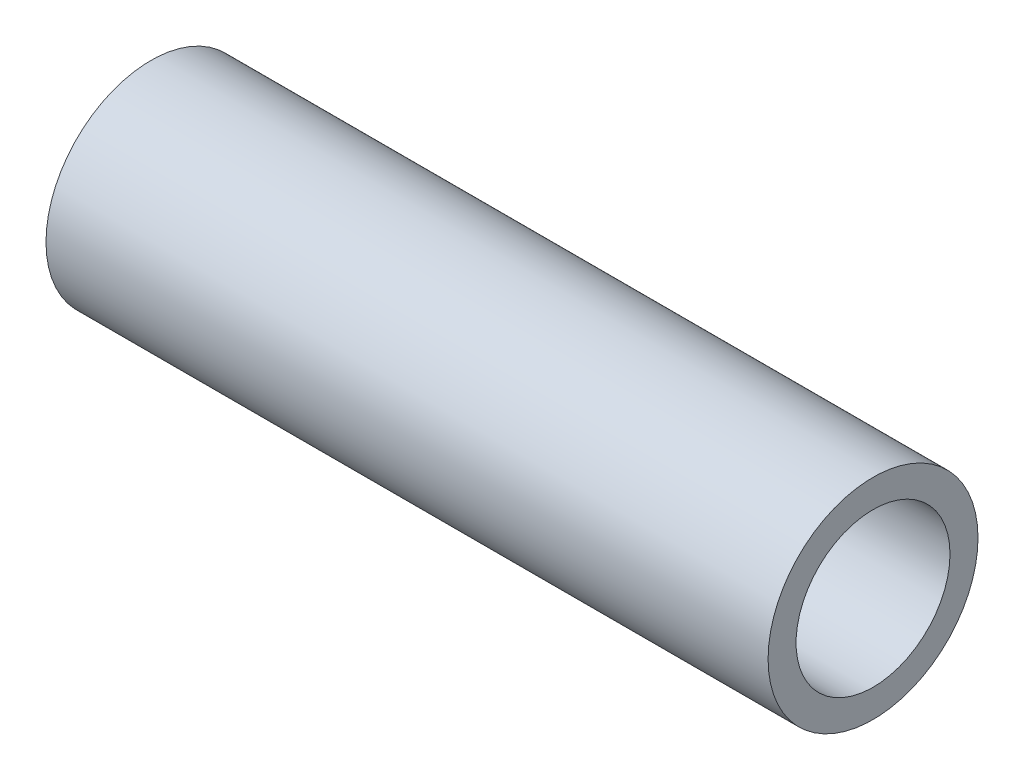
ISO-10303-21;
HEADER;
FILE_DESCRIPTION(('STEP AP214'),'2;1');
FILE_NAME('part.step','',(''),(''),'','','');
FILE_SCHEMA(('AUTOMOTIVE_DESIGN { 1 0 10303 214 1 1 1 1 }'));
ENDSEC;
DATA;
#1=APPLICATION_CONTEXT('core data for automotive mechanical design processes');
#2=APPLICATION_PROTOCOL_DEFINITION('international standard','automotive_design',2000,#1);
#3=PRODUCT_CONTEXT('',#1,'mechanical');
#4=PRODUCT('Part','Part','',(#3));
#5=PRODUCT_RELATED_PRODUCT_CATEGORY('part','',(#4));
#6=PRODUCT_DEFINITION_FORMATION('','',#4);
#7=PRODUCT_DEFINITION_CONTEXT('part definition',#1,'design');
#8=PRODUCT_DEFINITION('design','',#6,#7);
#9=PRODUCT_DEFINITION_SHAPE('','',#8);
#10=(LENGTH_UNIT() NAMED_UNIT(*) SI_UNIT(.MILLI.,.METRE.));
#11=(NAMED_UNIT(*) PLANE_ANGLE_UNIT() SI_UNIT($,.RADIAN.));
#12=(NAMED_UNIT(*) SI_UNIT($,.STERADIAN.) SOLID_ANGLE_UNIT());
#13=UNCERTAINTY_MEASURE_WITH_UNIT(LENGTH_MEASURE(1.E-05),#10,'distance_accuracy_value','');
#14=(GEOMETRIC_REPRESENTATION_CONTEXT(3) GLOBAL_UNCERTAINTY_ASSIGNED_CONTEXT((#13)) GLOBAL_UNIT_ASSIGNED_CONTEXT((#10,
#11,#12)) REPRESENTATION_CONTEXT('',''));
#15=CARTESIAN_POINT('',(0.,0.,0.));
#16=DIRECTION('',(0.,0.,1.));
#17=DIRECTION('',(1.,0.,0.));
#18=AXIS2_PLACEMENT_3D('',#15,#16,#17);
#19=CARTESIAN_POINT('',(-32.766,0.,0.));
#20=DIRECTION('',(1.,0.,0.));
#21=DIRECTION('',(0.,0.,-1.));
#22=AXIS2_PLACEMENT_3D('',#19,#20,#21);
#23=PLANE('',#22);
#24=CARTESIAN_POINT('',(-32.766,0.,0.));
#25=DIRECTION('',(1.,0.,0.));
#26=DIRECTION('',(0.,0.,-1.));
#27=AXIS2_PLACEMENT_3D('',#24,#25,#26);
#28=CIRCLE('',#27,6.985);
#29=CARTESIAN_POINT('',(-32.766,0.,-6.985));
#30=VERTEX_POINT('',#29);
#31=EDGE_CURVE('E59',#30,#30,#28,.T.);
#32=ORIENTED_EDGE('',*,*,#31,.T.);
#33=EDGE_LOOP('',(#32));
#34=FACE_BOUND('',#33,.T.);
#35=CARTESIAN_POINT('',(-32.766,0.,0.));
#36=DIRECTION('',(1.,0.,0.));
#37=DIRECTION('',(0.,0.,-1.));
#38=AXIS2_PLACEMENT_3D('',#35,#36,#37);
#39=CIRCLE('',#38,9.525);
#40=CARTESIAN_POINT('',(-32.766,0.,-9.525));
#41=VERTEX_POINT('',#40);
#42=EDGE_CURVE('E51',#41,#41,#39,.T.);
#43=ORIENTED_EDGE('',*,*,#42,.F.);
#44=EDGE_LOOP('',(#43));
#45=FACE_BOUND('',#44,.T.);
#46=ADVANCED_FACE('F45',(#34,#45),#23,.F.);
#47=CARTESIAN_POINT('',(32.766,0.,0.));
#48=DIRECTION('',(1.,0.,0.));
#49=DIRECTION('',(0.,0.,-1.));
#50=AXIS2_PLACEMENT_3D('',#47,#48,#49);
#51=PLANE('',#50);
#52=CARTESIAN_POINT('',(32.766,0.,0.));
#53=DIRECTION('',(1.,0.,0.));
#54=DIRECTION('',(0.,0.,-1.));
#55=AXIS2_PLACEMENT_3D('',#52,#53,#54);
#56=CIRCLE('',#55,6.985);
#57=CARTESIAN_POINT('',(32.766,0.,-6.985));
#58=VERTEX_POINT('',#57);
#59=EDGE_CURVE('E55',#58,#58,#56,.T.);
#60=ORIENTED_EDGE('',*,*,#59,.F.);
#61=EDGE_LOOP('',(#60));
#62=FACE_BOUND('',#61,.T.);
#63=CARTESIAN_POINT('',(32.766,0.,0.));
#64=DIRECTION('',(1.,0.,0.));
#65=DIRECTION('',(0.,0.,-1.));
#66=AXIS2_PLACEMENT_3D('',#63,#64,#65);
#67=CIRCLE('',#66,9.525);
#68=CARTESIAN_POINT('',(32.766,0.,-9.525));
#69=VERTEX_POINT('',#68);
#70=EDGE_CURVE('E11',#69,#69,#67,.T.);
#71=ORIENTED_EDGE('',*,*,#70,.T.);
#72=EDGE_LOOP('',(#71));
#73=FACE_BOUND('',#72,.T.);
#74=ADVANCED_FACE('F75',(#62,#73),#51,.T.);
#75=CARTESIAN_POINT('',(-32.766,0.,0.));
#76=DIRECTION('',(1.,0.,0.));
#77=DIRECTION('',(0.,0.,-1.));
#78=AXIS2_PLACEMENT_3D('',#75,#76,#77);
#79=CYLINDRICAL_SURFACE('',#78,9.525);
#80=ORIENTED_EDGE('',*,*,#70,.F.);
#81=EDGE_LOOP('',(#80));
#82=FACE_BOUND('',#81,.T.);
#83=ORIENTED_EDGE('',*,*,#42,.T.);
#84=EDGE_LOOP('',(#83));
#85=FACE_BOUND('',#84,.T.);
#86=ADVANCED_FACE('F69',(#82,#85),#79,.T.);
#87=CARTESIAN_POINT('',(-32.766,0.,0.));
#88=DIRECTION('',(1.,0.,0.));
#89=DIRECTION('',(0.,0.,-1.));
#90=AXIS2_PLACEMENT_3D('',#87,#88,#89);
#91=CYLINDRICAL_SURFACE('',#90,6.985);
#92=ORIENTED_EDGE('',*,*,#59,.T.);
#93=EDGE_LOOP('',(#92));
#94=FACE_BOUND('',#93,.T.);
#95=ORIENTED_EDGE('',*,*,#31,.F.);
#96=EDGE_LOOP('',(#95));
#97=FACE_BOUND('',#96,.T.);
#98=ADVANCED_FACE('F67',(#94,#97),#91,.F.);
#99=CLOSED_SHELL('',(#46,#74,#86,#98));
#100=MANIFOLD_SOLID_BREP('B2',#99);
#101=ADVANCED_BREP_SHAPE_REPRESENTATION('',(#18,#100),#14);
#102=SHAPE_DEFINITION_REPRESENTATION(#9,#101);
ENDSEC;
END-ISO-10303-21;
